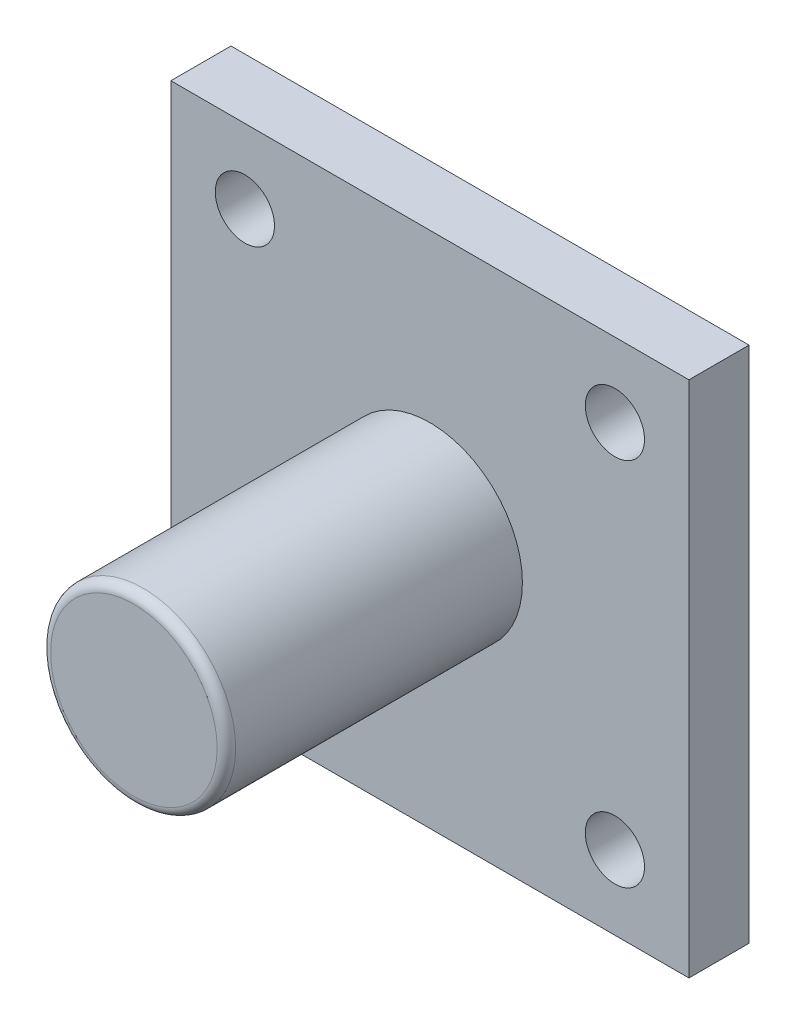
ISO-10303-21;
HEADER;
FILE_DESCRIPTION(('STEP AP214'),'2;1');
FILE_NAME('part.step','',(''),(''),'','','');
FILE_SCHEMA(('AUTOMOTIVE_DESIGN { 1 0 10303 214 1 1 1 1 }'));
ENDSEC;
DATA;
#1=APPLICATION_CONTEXT('core data for automotive mechanical design processes');
#2=APPLICATION_PROTOCOL_DEFINITION('international standard','automotive_design',2000,#1);
#3=PRODUCT_CONTEXT('',#1,'mechanical');
#4=PRODUCT('Part','Part','',(#3));
#5=PRODUCT_RELATED_PRODUCT_CATEGORY('part','',(#4));
#6=PRODUCT_DEFINITION_FORMATION('','',#4);
#7=PRODUCT_DEFINITION_CONTEXT('part definition',#1,'design');
#8=PRODUCT_DEFINITION('design','',#6,#7);
#9=PRODUCT_DEFINITION_SHAPE('','',#8);
#10=(LENGTH_UNIT() NAMED_UNIT(*) SI_UNIT(.MILLI.,.METRE.));
#11=(NAMED_UNIT(*) PLANE_ANGLE_UNIT() SI_UNIT($,.RADIAN.));
#12=(NAMED_UNIT(*) SI_UNIT($,.STERADIAN.) SOLID_ANGLE_UNIT());
#13=UNCERTAINTY_MEASURE_WITH_UNIT(LENGTH_MEASURE(1.E-05),#10,'distance_accuracy_value','');
#14=(GEOMETRIC_REPRESENTATION_CONTEXT(3) GLOBAL_UNCERTAINTY_ASSIGNED_CONTEXT((#13)) GLOBAL_UNIT_ASSIGNED_CONTEXT((#10,
#11,#12)) REPRESENTATION_CONTEXT('',''));
#15=CARTESIAN_POINT('',(0.,0.,0.));
#16=DIRECTION('',(0.,0.,1.));
#17=DIRECTION('',(1.,0.,0.));
#18=AXIS2_PLACEMENT_3D('',#15,#16,#17);
#19=CARTESIAN_POINT('',(0.,0.,0.));
#20=DIRECTION('',(0.,0.,-1.));
#21=DIRECTION('',(-1.,0.,0.));
#22=AXIS2_PLACEMENT_3D('',#19,#20,#21);
#23=PLANE('',#22);
#24=CARTESIAN_POINT('',(24.,4.,0.));
#25=DIRECTION('',(0.,0.,-1.));
#26=DIRECTION('',(-1.,0.,0.));
#27=AXIS2_PLACEMENT_3D('',#24,#25,#26);
#28=CIRCLE('',#27,1.6);
#29=CARTESIAN_POINT('',(22.4,4.,0.));
#30=VERTEX_POINT('',#29);
#31=EDGE_CURVE('E332',#30,#30,#28,.T.);
#32=ORIENTED_EDGE('',*,*,#31,.F.);
#33=EDGE_LOOP('',(#32));
#34=FACE_BOUND('',#33,.T.);
#35=CARTESIAN_POINT('',(4.,4.,0.));
#36=DIRECTION('',(0.,0.,-1.));
#37=DIRECTION('',(-1.,0.,0.));
#38=AXIS2_PLACEMENT_3D('',#35,#36,#37);
#39=CIRCLE('',#38,1.6);
#40=CARTESIAN_POINT('',(2.4,4.,0.));
#41=VERTEX_POINT('',#40);
#42=EDGE_CURVE('E338',#41,#41,#39,.T.);
#43=ORIENTED_EDGE('',*,*,#42,.F.);
#44=EDGE_LOOP('',(#43));
#45=FACE_BOUND('',#44,.T.);
#46=CARTESIAN_POINT('',(4.,24.,0.));
#47=DIRECTION('',(0.,0.,-1.));
#48=DIRECTION('',(-1.,0.,0.));
#49=AXIS2_PLACEMENT_3D('',#46,#47,#48);
#50=CIRCLE('',#49,1.6);
#51=CARTESIAN_POINT('',(2.4,24.,0.));
#52=VERTEX_POINT('',#51);
#53=EDGE_CURVE('E333',#52,#52,#50,.T.);
#54=ORIENTED_EDGE('',*,*,#53,.F.);
#55=EDGE_LOOP('',(#54));
#56=FACE_BOUND('',#55,.T.);
#57=CARTESIAN_POINT('',(24.,24.,0.));
#58=DIRECTION('',(0.,0.,-1.));
#59=DIRECTION('',(-1.,0.,0.));
#60=AXIS2_PLACEMENT_3D('',#57,#58,#59);
#61=CIRCLE('',#60,1.6);
#62=CARTESIAN_POINT('',(22.4,24.,0.));
#63=VERTEX_POINT('',#62);
#64=EDGE_CURVE('E337',#63,#63,#61,.T.);
#65=ORIENTED_EDGE('',*,*,#64,.F.);
#66=EDGE_LOOP('',(#65));
#67=FACE_BOUND('',#66,.T.);
#68=DIRECTION('',(0.,-1.,0.));
#69=VECTOR('',#68,1.);
#70=CARTESIAN_POINT('',(0.,0.,0.));
#71=LINE('',#70,#69);
#72=CARTESIAN_POINT('',(0.,28.,0.));
#73=VERTEX_POINT('',#72);
#74=CARTESIAN_POINT('',(0.,0.,0.));
#75=VERTEX_POINT('',#74);
#76=EDGE_CURVE('E364',#73,#75,#71,.T.);
#77=ORIENTED_EDGE('',*,*,#76,.F.);
#78=DIRECTION('',(-1.,0.,0.));
#79=VECTOR('',#78,1.);
#80=CARTESIAN_POINT('',(0.,28.,0.));
#81=LINE('',#80,#79);
#82=CARTESIAN_POINT('',(28.,28.,0.));
#83=VERTEX_POINT('',#82);
#84=EDGE_CURVE('E375',#83,#73,#81,.T.);
#85=ORIENTED_EDGE('',*,*,#84,.F.);
#86=DIRECTION('',(0.,1.,0.));
#87=VECTOR('',#86,1.);
#88=CARTESIAN_POINT('',(28.,0.,0.));
#89=LINE('',#88,#87);
#90=CARTESIAN_POINT('',(28.,0.,0.));
#91=VERTEX_POINT('',#90);
#92=EDGE_CURVE('E391',#91,#83,#89,.T.);
#93=ORIENTED_EDGE('',*,*,#92,.F.);
#94=DIRECTION('',(1.,0.,0.));
#95=VECTOR('',#94,1.);
#96=CARTESIAN_POINT('',(0.,0.,0.));
#97=LINE('',#96,#95);
#98=EDGE_CURVE('E388',#75,#91,#97,.T.);
#99=ORIENTED_EDGE('',*,*,#98,.F.);
#100=EDGE_LOOP('',(#77,#85,#93,#99));
#101=FACE_BOUND('',#100,.T.);
#102=DIRECTION('',(-1.,0.,0.));
#103=VECTOR('',#102,1.);
#104=CARTESIAN_POINT('',(20.5,23.,0.));
#105=LINE('',#104,#103);
#106=CARTESIAN_POINT('',(20.5,23.,0.));
#107=VERTEX_POINT('',#106);
#108=CARTESIAN_POINT('',(7.50000000000001,23.,0.));
#109=VERTEX_POINT('',#108);
#110=EDGE_CURVE('E310',#107,#109,#105,.T.);
#111=ORIENTED_EDGE('',*,*,#110,.F.);
#112=DIRECTION('',(0.,-1.,0.));
#113=VECTOR('',#112,1.);
#114=CARTESIAN_POINT('',(20.5,25.5,0.));
#115=LINE('',#114,#113);
#116=CARTESIAN_POINT('',(20.5,25.5,0.));
#117=VERTEX_POINT('',#116);
#118=EDGE_CURVE('E291',#117,#107,#115,.T.);
#119=ORIENTED_EDGE('',*,*,#118,.F.);
#120=DIRECTION('',(1.,0.,0.));
#121=VECTOR('',#120,1.);
#122=CARTESIAN_POINT('',(20.5,25.5,0.));
#123=LINE('',#122,#121);
#124=CARTESIAN_POINT('',(7.50000000000001,25.5,0.));
#125=VERTEX_POINT('',#124);
#126=EDGE_CURVE('E297',#125,#117,#123,.T.);
#127=ORIENTED_EDGE('',*,*,#126,.F.);
#128=DIRECTION('',(0.,1.,0.));
#129=VECTOR('',#128,1.);
#130=CARTESIAN_POINT('',(7.50000000000001,25.5,0.));
#131=LINE('',#130,#129);
#132=EDGE_CURVE('E313',#109,#125,#131,.T.);
#133=ORIENTED_EDGE('',*,*,#132,.F.);
#134=EDGE_LOOP('',(#111,#119,#127,#133));
#135=FACE_BOUND('',#134,.T.);
#136=DIRECTION('',(-1.,0.,0.));
#137=VECTOR('',#136,1.);
#138=CARTESIAN_POINT('',(5.,7.5,0.));
#139=LINE('',#138,#137);
#140=CARTESIAN_POINT('',(5.,7.5,0.));
#141=VERTEX_POINT('',#140);
#142=CARTESIAN_POINT('',(2.5,7.5,0.));
#143=VERTEX_POINT('',#142);
#144=EDGE_CURVE('E269',#141,#143,#139,.T.);
#145=ORIENTED_EDGE('',*,*,#144,.F.);
#146=DIRECTION('',(0.,-1.,0.));
#147=VECTOR('',#146,1.);
#148=CARTESIAN_POINT('',(5.,20.5,0.));
#149=LINE('',#148,#147);
#150=CARTESIAN_POINT('',(5.,20.5,0.));
#151=VERTEX_POINT('',#150);
#152=EDGE_CURVE('E250',#151,#141,#149,.T.);
#153=ORIENTED_EDGE('',*,*,#152,.F.);
#154=DIRECTION('',(1.,0.,0.));
#155=VECTOR('',#154,1.);
#156=CARTESIAN_POINT('',(5.,20.5,0.));
#157=LINE('',#156,#155);
#158=CARTESIAN_POINT('',(2.5,20.5,0.));
#159=VERTEX_POINT('',#158);
#160=EDGE_CURVE('E256',#159,#151,#157,.T.);
#161=ORIENTED_EDGE('',*,*,#160,.F.);
#162=DIRECTION('',(0.,1.,0.));
#163=VECTOR('',#162,1.);
#164=CARTESIAN_POINT('',(2.5,20.5,0.));
#165=LINE('',#164,#163);
#166=EDGE_CURVE('E272',#143,#159,#165,.T.);
#167=ORIENTED_EDGE('',*,*,#166,.F.);
#168=EDGE_LOOP('',(#145,#153,#161,#167));
#169=FACE_BOUND('',#168,.T.);
#170=DIRECTION('',(1.,0.,0.));
#171=VECTOR('',#170,1.);
#172=CARTESIAN_POINT('',(7.5,5.,0.));
#173=LINE('',#172,#171);
#174=CARTESIAN_POINT('',(7.5,5.,0.));
#175=VERTEX_POINT('',#174);
#176=CARTESIAN_POINT('',(20.5,5.,0.));
#177=VERTEX_POINT('',#176);
#178=EDGE_CURVE('E211',#175,#177,#173,.T.);
#179=ORIENTED_EDGE('',*,*,#178,.F.);
#180=DIRECTION('',(0.,1.,0.));
#181=VECTOR('',#180,1.);
#182=CARTESIAN_POINT('',(7.5,5.,0.));
#183=LINE('',#182,#181);
#184=CARTESIAN_POINT('',(7.5,2.5,0.));
#185=VERTEX_POINT('',#184);
#186=EDGE_CURVE('E206',#185,#175,#183,.T.);
#187=ORIENTED_EDGE('',*,*,#186,.F.);
#188=DIRECTION('',(-1.,0.,0.));
#189=VECTOR('',#188,1.);
#190=CARTESIAN_POINT('',(7.5,2.5,0.));
#191=LINE('',#190,#189);
#192=CARTESIAN_POINT('',(20.5,2.5,0.));
#193=VERTEX_POINT('',#192);
#194=EDGE_CURVE('E221',#193,#185,#191,.T.);
#195=ORIENTED_EDGE('',*,*,#194,.F.);
#196=DIRECTION('',(0.,-1.,0.));
#197=VECTOR('',#196,1.);
#198=CARTESIAN_POINT('',(20.5,5.,0.));
#199=LINE('',#198,#197);
#200=EDGE_CURVE('E233',#177,#193,#199,.T.);
#201=ORIENTED_EDGE('',*,*,#200,.F.);
#202=EDGE_LOOP('',(#179,#187,#195,#201));
#203=FACE_BOUND('',#202,.T.);
#204=DIRECTION('',(1.,0.,0.));
#205=VECTOR('',#204,1.);
#206=CARTESIAN_POINT('',(23.,20.5,0.));
#207=LINE('',#206,#205);
#208=CARTESIAN_POINT('',(23.,20.5,0.));
#209=VERTEX_POINT('',#208);
#210=CARTESIAN_POINT('',(25.5,20.5,0.));
#211=VERTEX_POINT('',#210);
#212=EDGE_CURVE('E767',#209,#211,#207,.T.);
#213=ORIENTED_EDGE('',*,*,#212,.F.);
#214=DIRECTION('',(0.,1.,0.));
#215=VECTOR('',#214,1.);
#216=CARTESIAN_POINT('',(23.,7.5,0.));
#217=LINE('',#216,#215);
#218=CARTESIAN_POINT('',(23.,7.5,0.));
#219=VERTEX_POINT('',#218);
#220=EDGE_CURVE('E203',#219,#209,#217,.T.);
#221=ORIENTED_EDGE('',*,*,#220,.F.);
#222=DIRECTION('',(-1.,0.,0.));
#223=VECTOR('',#222,1.);
#224=CARTESIAN_POINT('',(23.,7.5,0.));
#225=LINE('',#224,#223);
#226=CARTESIAN_POINT('',(25.5,7.5,0.));
#227=VERTEX_POINT('',#226);
#228=EDGE_CURVE('E199',#227,#219,#225,.T.);
#229=ORIENTED_EDGE('',*,*,#228,.F.);
#230=DIRECTION('',(0.,-1.,0.));
#231=VECTOR('',#230,1.);
#232=CARTESIAN_POINT('',(25.5,7.5,0.));
#233=LINE('',#232,#231);
#234=EDGE_CURVE('E763',#211,#227,#233,.T.);
#235=ORIENTED_EDGE('',*,*,#234,.F.);
#236=EDGE_LOOP('',(#213,#221,#229,#235));
#237=FACE_BOUND('',#236,.T.);
#238=ADVANCED_FACE('F39',(#34,#45,#56,#67,#101,#135,#169,#203,#237),#23,.T.);
#239=CARTESIAN_POINT('',(0.,0.,3.25));
#240=DIRECTION('',(1.,0.,0.));
#241=DIRECTION('',(0.,1.,0.));
#242=AXIS2_PLACEMENT_3D('',#239,#240,#241);
#243=PLANE('',#242);
#244=ORIENTED_EDGE('',*,*,#76,.T.);
#245=DIRECTION('',(0.,0.,-1.));
#246=VECTOR('',#245,1.);
#247=CARTESIAN_POINT('',(0.,0.,3.25));
#248=LINE('',#247,#246);
#249=CARTESIAN_POINT('',(0.,0.,3.25));
#250=VERTEX_POINT('',#249);
#251=EDGE_CURVE('E369',#250,#75,#248,.T.);
#252=ORIENTED_EDGE('',*,*,#251,.F.);
#253=DIRECTION('',(0.,-1.,0.));
#254=VECTOR('',#253,1.);
#255=CARTESIAN_POINT('',(0.,0.,3.25));
#256=LINE('',#255,#254);
#257=CARTESIAN_POINT('',(0.,28.,3.25));
#258=VERTEX_POINT('',#257);
#259=EDGE_CURVE('E370',#258,#250,#256,.T.);
#260=ORIENTED_EDGE('',*,*,#259,.F.);
#261=DIRECTION('',(0.,0.,-1.));
#262=VECTOR('',#261,1.);
#263=CARTESIAN_POINT('',(0.,28.,3.25));
#264=LINE('',#263,#262);
#265=EDGE_CURVE('E384',#258,#73,#264,.T.);
#266=ORIENTED_EDGE('',*,*,#265,.T.);
#267=EDGE_LOOP('',(#244,#252,#260,#266));
#268=FACE_BOUND('',#267,.T.);
#269=ADVANCED_FACE('F431',(#268),#243,.F.);
#270=CARTESIAN_POINT('',(0.,0.,3.25));
#271=DIRECTION('',(0.,1.,0.));
#272=DIRECTION('',(0.,0.,1.));
#273=AXIS2_PLACEMENT_3D('',#270,#271,#272);
#274=PLANE('',#273);
#275=ORIENTED_EDGE('',*,*,#98,.T.);
#276=DIRECTION('',(0.,0.,-1.));
#277=VECTOR('',#276,1.);
#278=CARTESIAN_POINT('',(28.,0.,3.25));
#279=LINE('',#278,#277);
#280=CARTESIAN_POINT('',(28.,0.,3.25));
#281=VERTEX_POINT('',#280);
#282=EDGE_CURVE('E403',#281,#91,#279,.T.);
#283=ORIENTED_EDGE('',*,*,#282,.F.);
#284=DIRECTION('',(1.,0.,0.));
#285=VECTOR('',#284,1.);
#286=CARTESIAN_POINT('',(0.,0.,3.25));
#287=LINE('',#286,#285);
#288=EDGE_CURVE('E374',#250,#281,#287,.T.);
#289=ORIENTED_EDGE('',*,*,#288,.F.);
#290=ORIENTED_EDGE('',*,*,#251,.T.);
#291=EDGE_LOOP('',(#275,#283,#289,#290));
#292=FACE_BOUND('',#291,.T.);
#293=ADVANCED_FACE('F437',(#292),#274,.F.);
#294=CARTESIAN_POINT('',(28.,0.,3.25));
#295=DIRECTION('',(-1.,0.,0.));
#296=DIRECTION('',(0.,-1.,0.));
#297=AXIS2_PLACEMENT_3D('',#294,#295,#296);
#298=PLANE('',#297);
#299=ORIENTED_EDGE('',*,*,#92,.T.);
#300=DIRECTION('',(0.,0.,-1.));
#301=VECTOR('',#300,1.);
#302=CARTESIAN_POINT('',(28.,28.,3.25));
#303=LINE('',#302,#301);
#304=CARTESIAN_POINT('',(28.,28.,3.25));
#305=VERTEX_POINT('',#304);
#306=EDGE_CURVE('E399',#305,#83,#303,.T.);
#307=ORIENTED_EDGE('',*,*,#306,.F.);
#308=DIRECTION('',(0.,1.,0.));
#309=VECTOR('',#308,1.);
#310=CARTESIAN_POINT('',(28.,0.,3.25));
#311=LINE('',#310,#309);
#312=EDGE_CURVE('E378',#281,#305,#311,.T.);
#313=ORIENTED_EDGE('',*,*,#312,.F.);
#314=ORIENTED_EDGE('',*,*,#282,.T.);
#315=EDGE_LOOP('',(#299,#307,#313,#314));
#316=FACE_BOUND('',#315,.T.);
#317=ADVANCED_FACE('F448',(#316),#298,.F.);
#318=CARTESIAN_POINT('',(0.,28.,3.25));
#319=DIRECTION('',(0.,-1.,0.));
#320=DIRECTION('',(0.,0.,-1.));
#321=AXIS2_PLACEMENT_3D('',#318,#319,#320);
#322=PLANE('',#321);
#323=ORIENTED_EDGE('',*,*,#84,.T.);
#324=ORIENTED_EDGE('',*,*,#265,.F.);
#325=DIRECTION('',(-1.,0.,0.));
#326=VECTOR('',#325,1.);
#327=CARTESIAN_POINT('',(0.,28.,3.25));
#328=LINE('',#327,#326);
#329=EDGE_CURVE('E381',#305,#258,#328,.T.);
#330=ORIENTED_EDGE('',*,*,#329,.F.);
#331=ORIENTED_EDGE('',*,*,#306,.T.);
#332=EDGE_LOOP('',(#323,#324,#330,#331));
#333=FACE_BOUND('',#332,.T.);
#334=ADVANCED_FACE('F445',(#333),#322,.F.);
#335=CARTESIAN_POINT('',(0.,0.,3.25));
#336=DIRECTION('',(0.,0.,-1.));
#337=DIRECTION('',(-1.,0.,0.));
#338=AXIS2_PLACEMENT_3D('',#335,#336,#337);
#339=PLANE('',#338);
#340=CARTESIAN_POINT('',(24.,4.,3.25));
#341=DIRECTION('',(0.,0.,-1.));
#342=DIRECTION('',(-1.,0.,0.));
#343=AXIS2_PLACEMENT_3D('',#340,#341,#342);
#344=CIRCLE('',#343,1.6);
#345=CARTESIAN_POINT('',(22.4,4.,3.25));
#346=VERTEX_POINT('',#345);
#347=EDGE_CURVE('E360',#346,#346,#344,.T.);
#348=ORIENTED_EDGE('',*,*,#347,.T.);
#349=EDGE_LOOP('',(#348));
#350=FACE_BOUND('',#349,.T.);
#351=CARTESIAN_POINT('',(4.,4.,3.25));
#352=DIRECTION('',(0.,0.,-1.));
#353=DIRECTION('',(-1.,0.,0.));
#354=AXIS2_PLACEMENT_3D('',#351,#352,#353);
#355=CIRCLE('',#354,1.6);
#356=CARTESIAN_POINT('',(2.4,4.,3.25));
#357=VERTEX_POINT('',#356);
#358=EDGE_CURVE('E356',#357,#357,#355,.T.);
#359=ORIENTED_EDGE('',*,*,#358,.T.);
#360=EDGE_LOOP('',(#359));
#361=FACE_BOUND('',#360,.T.);
#362=CARTESIAN_POINT('',(4.,24.,3.25));
#363=DIRECTION('',(0.,0.,-1.));
#364=DIRECTION('',(-1.,0.,0.));
#365=AXIS2_PLACEMENT_3D('',#362,#363,#364);
#366=CIRCLE('',#365,1.6);
#367=CARTESIAN_POINT('',(2.4,24.,3.25));
#368=VERTEX_POINT('',#367);
#369=EDGE_CURVE('E352',#368,#368,#366,.T.);
#370=ORIENTED_EDGE('',*,*,#369,.T.);
#371=EDGE_LOOP('',(#370));
#372=FACE_BOUND('',#371,.T.);
#373=CARTESIAN_POINT('',(24.,24.,3.25));
#374=DIRECTION('',(0.,0.,-1.));
#375=DIRECTION('',(-1.,0.,0.));
#376=AXIS2_PLACEMENT_3D('',#373,#374,#375);
#377=CIRCLE('',#376,1.6);
#378=CARTESIAN_POINT('',(22.4,24.,3.25));
#379=VERTEX_POINT('',#378);
#380=EDGE_CURVE('E348',#379,#379,#377,.T.);
#381=ORIENTED_EDGE('',*,*,#380,.T.);
#382=EDGE_LOOP('',(#381));
#383=FACE_BOUND('',#382,.T.);
#384=CARTESIAN_POINT('',(14.,14.,3.25));
#385=DIRECTION('',(0.,0.,1.));
#386=DIRECTION('',(1.,0.,0.));
#387=AXIS2_PLACEMENT_3D('',#384,#385,#386);
#388=CIRCLE('',#387,5.);
#389=CARTESIAN_POINT('',(19.,14.,3.25));
#390=VERTEX_POINT('',#389);
#391=EDGE_CURVE('E365',#390,#390,#388,.T.);
#392=ORIENTED_EDGE('',*,*,#391,.F.);
#393=EDGE_LOOP('',(#392));
#394=FACE_BOUND('',#393,.T.);
#395=ORIENTED_EDGE('',*,*,#259,.T.);
#396=ORIENTED_EDGE('',*,*,#288,.T.);
#397=ORIENTED_EDGE('',*,*,#312,.T.);
#398=ORIENTED_EDGE('',*,*,#329,.T.);
#399=EDGE_LOOP('',(#395,#396,#397,#398));
#400=FACE_BOUND('',#399,.T.);
#401=ADVANCED_FACE('F443',(#350,#361,#372,#383,#394,#400),#339,.F.);
#402=CARTESIAN_POINT('',(14.,14.,19.25));
#403=DIRECTION('',(0.,0.,-1.));
#404=DIRECTION('',(-1.,0.,0.));
#405=AXIS2_PLACEMENT_3D('',#402,#403,#404);
#406=CYLINDRICAL_SURFACE('',#405,5.);
#407=CARTESIAN_POINT('',(14.,14.,18.75));
#408=DIRECTION('',(0.,0.,1.));
#409=DIRECTION('',(1.,0.,0.));
#410=AXIS2_PLACEMENT_3D('',#407,#408,#409);
#411=CIRCLE('',#410,5.);
#412=CARTESIAN_POINT('',(19.,14.,18.75));
#413=VERTEX_POINT('',#412);
#414=EDGE_CURVE('E11',#413,#413,#411,.F.);
#415=ORIENTED_EDGE('',*,*,#414,.T.);
#416=EDGE_LOOP('',(#415));
#417=FACE_BOUND('',#416,.T.);
#418=ORIENTED_EDGE('',*,*,#391,.T.);
#419=EDGE_LOOP('',(#418));
#420=FACE_BOUND('',#419,.T.);
#421=ADVANCED_FACE('F471',(#417,#420),#406,.T.);
#422=CARTESIAN_POINT('',(14.,14.,19.25));
#423=DIRECTION('',(0.,0.,1.));
#424=DIRECTION('',(1.,0.,0.));
#425=AXIS2_PLACEMENT_3D('',#422,#423,#424);
#426=PLANE('',#425);
#427=CARTESIAN_POINT('',(14.,14.,19.25));
#428=DIRECTION('',(0.,0.,1.));
#429=DIRECTION('',(1.,0.,0.));
#430=AXIS2_PLACEMENT_3D('',#427,#428,#429);
#431=CIRCLE('',#430,4.5);
#432=CARTESIAN_POINT('',(18.5,14.,19.25));
#433=VERTEX_POINT('',#432);
#434=EDGE_CURVE('E48',#433,#433,#431,.T.);
#435=ORIENTED_EDGE('',*,*,#434,.T.);
#436=EDGE_LOOP('',(#435));
#437=FACE_BOUND('',#436,.T.);
#438=ADVANCED_FACE('F413',(#437),#426,.T.);
#439=CARTESIAN_POINT('',(24.,24.,19.25));
#440=DIRECTION('',(0.,0.,-1.));
#441=DIRECTION('',(-1.,0.,0.));
#442=AXIS2_PLACEMENT_3D('',#439,#440,#441);
#443=CYLINDRICAL_SURFACE('',#442,1.6);
#444=ORIENTED_EDGE('',*,*,#64,.T.);
#445=EDGE_LOOP('',(#444));
#446=FACE_BOUND('',#445,.T.);
#447=ORIENTED_EDGE('',*,*,#380,.F.);
#448=EDGE_LOOP('',(#447));
#449=FACE_BOUND('',#448,.T.);
#450=ADVANCED_FACE('F488',(#446,#449),#443,.F.);
#451=CARTESIAN_POINT('',(4.,24.,19.25));
#452=DIRECTION('',(0.,0.,-1.));
#453=DIRECTION('',(-1.,0.,0.));
#454=AXIS2_PLACEMENT_3D('',#451,#452,#453);
#455=CYLINDRICAL_SURFACE('',#454,1.6);
#456=ORIENTED_EDGE('',*,*,#53,.T.);
#457=EDGE_LOOP('',(#456));
#458=FACE_BOUND('',#457,.T.);
#459=ORIENTED_EDGE('',*,*,#369,.F.);
#460=EDGE_LOOP('',(#459));
#461=FACE_BOUND('',#460,.T.);
#462=ADVANCED_FACE('F490',(#458,#461),#455,.F.);
#463=CARTESIAN_POINT('',(4.,4.,19.25));
#464=DIRECTION('',(0.,0.,-1.));
#465=DIRECTION('',(-1.,0.,0.));
#466=AXIS2_PLACEMENT_3D('',#463,#464,#465);
#467=CYLINDRICAL_SURFACE('',#466,1.6);
#468=ORIENTED_EDGE('',*,*,#42,.T.);
#469=EDGE_LOOP('',(#468));
#470=FACE_BOUND('',#469,.T.);
#471=ORIENTED_EDGE('',*,*,#358,.F.);
#472=EDGE_LOOP('',(#471));
#473=FACE_BOUND('',#472,.T.);
#474=ADVANCED_FACE('F426',(#470,#473),#467,.F.);
#475=CARTESIAN_POINT('',(24.,4.,19.25));
#476=DIRECTION('',(0.,0.,-1.));
#477=DIRECTION('',(-1.,0.,0.));
#478=AXIS2_PLACEMENT_3D('',#475,#476,#477);
#479=CYLINDRICAL_SURFACE('',#478,1.6);
#480=ORIENTED_EDGE('',*,*,#31,.T.);
#481=EDGE_LOOP('',(#480));
#482=FACE_BOUND('',#481,.T.);
#483=ORIENTED_EDGE('',*,*,#347,.F.);
#484=EDGE_LOOP('',(#483));
#485=FACE_BOUND('',#484,.T.);
#486=ADVANCED_FACE('F417',(#482,#485),#479,.F.);
#487=CARTESIAN_POINT('',(14.,14.,18.75));
#488=DIRECTION('',(0.,0.,1.));
#489=DIRECTION('',(1.,0.,0.));
#490=AXIS2_PLACEMENT_3D('',#487,#488,#489);
#491=TOROIDAL_SURFACE('',#490,4.5,0.5);
#492=ORIENTED_EDGE('',*,*,#414,.F.);
#493=EDGE_LOOP('',(#492));
#494=FACE_BOUND('',#493,.T.);
#495=ORIENTED_EDGE('',*,*,#434,.F.);
#496=EDGE_LOOP('',(#495));
#497=FACE_BOUND('',#496,.T.);
#498=ADVANCED_FACE('F41',(#494,#497),#491,.T.);
#499=CARTESIAN_POINT('',(20.5,25.5,-0.5));
#500=DIRECTION('',(-1.,0.,0.));
#501=DIRECTION('',(0.,0.,1.));
#502=AXIS2_PLACEMENT_3D('',#499,#500,#501);
#503=PLANE('',#502);
#504=ORIENTED_EDGE('',*,*,#118,.T.);
#505=DIRECTION('',(0.,0.,1.));
#506=VECTOR('',#505,1.);
#507=CARTESIAN_POINT('',(20.5,23.,-0.5));
#508=LINE('',#507,#506);
#509=CARTESIAN_POINT('',(20.5,23.,-0.5));
#510=VERTEX_POINT('',#509);
#511=EDGE_CURVE('E329',#510,#107,#508,.T.);
#512=ORIENTED_EDGE('',*,*,#511,.F.);
#513=DIRECTION('',(0.,-1.,0.));
#514=VECTOR('',#513,1.);
#515=CARTESIAN_POINT('',(20.5,25.5,-0.5));
#516=LINE('',#515,#514);
#517=CARTESIAN_POINT('',(20.5,25.5,-0.5));
#518=VERTEX_POINT('',#517);
#519=EDGE_CURVE('E292',#518,#510,#516,.T.);
#520=ORIENTED_EDGE('',*,*,#519,.F.);
#521=DIRECTION('',(0.,0.,1.));
#522=VECTOR('',#521,1.);
#523=CARTESIAN_POINT('',(20.5,25.5,-0.5));
#524=LINE('',#523,#522);
#525=EDGE_CURVE('E306',#518,#117,#524,.T.);
#526=ORIENTED_EDGE('',*,*,#525,.T.);
#527=EDGE_LOOP('',(#504,#512,#520,#526));
#528=FACE_BOUND('',#527,.T.);
#529=ADVANCED_FACE('F416',(#528),#503,.F.);
#530=CARTESIAN_POINT('',(20.5,23.,-0.5));
#531=DIRECTION('',(0.,1.,0.));
#532=DIRECTION('',(0.,0.,1.));
#533=AXIS2_PLACEMENT_3D('',#530,#531,#532);
#534=PLANE('',#533);
#535=ORIENTED_EDGE('',*,*,#110,.T.);
#536=DIRECTION('',(0.,0.,1.));
#537=VECTOR('',#536,1.);
#538=CARTESIAN_POINT('',(7.50000000000001,23.,-0.5));
#539=LINE('',#538,#537);
#540=CARTESIAN_POINT('',(7.50000000000001,23.,-0.5));
#541=VERTEX_POINT('',#540);
#542=EDGE_CURVE('E325',#541,#109,#539,.T.);
#543=ORIENTED_EDGE('',*,*,#542,.F.);
#544=DIRECTION('',(-1.,0.,0.));
#545=VECTOR('',#544,1.);
#546=CARTESIAN_POINT('',(20.5,23.,-0.5));
#547=LINE('',#546,#545);
#548=EDGE_CURVE('E296',#510,#541,#547,.T.);
#549=ORIENTED_EDGE('',*,*,#548,.F.);
#550=ORIENTED_EDGE('',*,*,#511,.T.);
#551=EDGE_LOOP('',(#535,#543,#549,#550));
#552=FACE_BOUND('',#551,.T.);
#553=ADVANCED_FACE('F423',(#552),#534,.F.);
#554=CARTESIAN_POINT('',(7.50000000000001,25.5,-0.5));
#555=DIRECTION('',(1.,0.,0.));
#556=DIRECTION('',(0.,0.,-1.));
#557=AXIS2_PLACEMENT_3D('',#554,#555,#556);
#558=PLANE('',#557);
#559=ORIENTED_EDGE('',*,*,#132,.T.);
#560=DIRECTION('',(0.,0.,1.));
#561=VECTOR('',#560,1.);
#562=CARTESIAN_POINT('',(7.50000000000001,25.5,-0.5));
#563=LINE('',#562,#561);
#564=CARTESIAN_POINT('',(7.50000000000001,25.5,-0.5));
#565=VERTEX_POINT('',#564);
#566=EDGE_CURVE('E322',#565,#125,#563,.T.);
#567=ORIENTED_EDGE('',*,*,#566,.F.);
#568=DIRECTION('',(0.,1.,0.));
#569=VECTOR('',#568,1.);
#570=CARTESIAN_POINT('',(7.50000000000001,25.5,-0.5));
#571=LINE('',#570,#569);
#572=EDGE_CURVE('E300',#541,#565,#571,.T.);
#573=ORIENTED_EDGE('',*,*,#572,.F.);
#574=ORIENTED_EDGE('',*,*,#542,.T.);
#575=EDGE_LOOP('',(#559,#567,#573,#574));
#576=FACE_BOUND('',#575,.T.);
#577=ADVANCED_FACE('F506',(#576),#558,.F.);
#578=CARTESIAN_POINT('',(20.5,25.5,-0.5));
#579=DIRECTION('',(0.,-1.,0.));
#580=DIRECTION('',(1.,0.,0.));
#581=AXIS2_PLACEMENT_3D('',#578,#579,#580);
#582=PLANE('',#581);
#583=ORIENTED_EDGE('',*,*,#126,.T.);
#584=ORIENTED_EDGE('',*,*,#525,.F.);
#585=DIRECTION('',(1.,0.,0.));
#586=VECTOR('',#585,1.);
#587=CARTESIAN_POINT('',(20.5,25.5,-0.5));
#588=LINE('',#587,#586);
#589=EDGE_CURVE('E303',#565,#518,#588,.T.);
#590=ORIENTED_EDGE('',*,*,#589,.F.);
#591=ORIENTED_EDGE('',*,*,#566,.T.);
#592=EDGE_LOOP('',(#583,#584,#590,#591));
#593=FACE_BOUND('',#592,.T.);
#594=ADVANCED_FACE('F510',(#593),#582,.F.);
#595=CARTESIAN_POINT('',(0.,0.,-0.5));
#596=DIRECTION('',(0.,0.,-1.));
#597=DIRECTION('',(-1.,0.,0.));
#598=AXIS2_PLACEMENT_3D('',#595,#596,#597);
#599=PLANE('',#598);
#600=ORIENTED_EDGE('',*,*,#519,.T.);
#601=ORIENTED_EDGE('',*,*,#548,.T.);
#602=ORIENTED_EDGE('',*,*,#572,.T.);
#603=ORIENTED_EDGE('',*,*,#589,.T.);
#604=EDGE_LOOP('',(#600,#601,#602,#603));
#605=FACE_BOUND('',#604,.T.);
#606=ADVANCED_FACE('F514',(#605),#599,.T.);
#607=CARTESIAN_POINT('',(5.,20.5,-0.5));
#608=DIRECTION('',(-1.,0.,0.));
#609=DIRECTION('',(0.,-1.,0.));
#610=AXIS2_PLACEMENT_3D('',#607,#608,#609);
#611=PLANE('',#610);
#612=ORIENTED_EDGE('',*,*,#152,.T.);
#613=DIRECTION('',(0.,0.,1.));
#614=VECTOR('',#613,1.);
#615=CARTESIAN_POINT('',(5.,7.5,-0.5));
#616=LINE('',#615,#614);
#617=CARTESIAN_POINT('',(5.,7.5,-0.5));
#618=VERTEX_POINT('',#617);
#619=EDGE_CURVE('E288',#618,#141,#616,.T.);
#620=ORIENTED_EDGE('',*,*,#619,.F.);
#621=DIRECTION('',(0.,-1.,0.));
#622=VECTOR('',#621,1.);
#623=CARTESIAN_POINT('',(5.,20.5,-0.5));
#624=LINE('',#623,#622);
#625=CARTESIAN_POINT('',(5.,20.5,-0.5));
#626=VERTEX_POINT('',#625);
#627=EDGE_CURVE('E251',#626,#618,#624,.T.);
#628=ORIENTED_EDGE('',*,*,#627,.F.);
#629=DIRECTION('',(0.,0.,1.));
#630=VECTOR('',#629,1.);
#631=CARTESIAN_POINT('',(5.,20.5,-0.5));
#632=LINE('',#631,#630);
#633=EDGE_CURVE('E265',#626,#151,#632,.T.);
#634=ORIENTED_EDGE('',*,*,#633,.T.);
#635=EDGE_LOOP('',(#612,#620,#628,#634));
#636=FACE_BOUND('',#635,.T.);
#637=ADVANCED_FACE('F518',(#636),#611,.F.);
#638=CARTESIAN_POINT('',(5.,7.5,-0.5));
#639=DIRECTION('',(0.,1.,0.));
#640=DIRECTION('',(0.,0.,1.));
#641=AXIS2_PLACEMENT_3D('',#638,#639,#640);
#642=PLANE('',#641);
#643=ORIENTED_EDGE('',*,*,#144,.T.);
#644=DIRECTION('',(0.,0.,1.));
#645=VECTOR('',#644,1.);
#646=CARTESIAN_POINT('',(2.5,7.5,-0.5));
#647=LINE('',#646,#645);
#648=CARTESIAN_POINT('',(2.5,7.5,-0.5));
#649=VERTEX_POINT('',#648);
#650=EDGE_CURVE('E284',#649,#143,#647,.T.);
#651=ORIENTED_EDGE('',*,*,#650,.F.);
#652=DIRECTION('',(-1.,0.,0.));
#653=VECTOR('',#652,1.);
#654=CARTESIAN_POINT('',(5.,7.5,-0.5));
#655=LINE('',#654,#653);
#656=EDGE_CURVE('E255',#618,#649,#655,.T.);
#657=ORIENTED_EDGE('',*,*,#656,.F.);
#658=ORIENTED_EDGE('',*,*,#619,.T.);
#659=EDGE_LOOP('',(#643,#651,#657,#658));
#660=FACE_BOUND('',#659,.T.);
#661=ADVANCED_FACE('F522',(#660),#642,.F.);
#662=CARTESIAN_POINT('',(2.5,20.5,-0.5));
#663=DIRECTION('',(1.,0.,0.));
#664=DIRECTION('',(0.,1.,0.));
#665=AXIS2_PLACEMENT_3D('',#662,#663,#664);
#666=PLANE('',#665);
#667=ORIENTED_EDGE('',*,*,#166,.T.);
#668=DIRECTION('',(0.,0.,1.));
#669=VECTOR('',#668,1.);
#670=CARTESIAN_POINT('',(2.5,20.5,-0.5));
#671=LINE('',#670,#669);
#672=CARTESIAN_POINT('',(2.5,20.5,-0.5));
#673=VERTEX_POINT('',#672);
#674=EDGE_CURVE('E281',#673,#159,#671,.T.);
#675=ORIENTED_EDGE('',*,*,#674,.F.);
#676=DIRECTION('',(0.,1.,0.));
#677=VECTOR('',#676,1.);
#678=CARTESIAN_POINT('',(2.5,20.5,-0.5));
#679=LINE('',#678,#677);
#680=EDGE_CURVE('E259',#649,#673,#679,.T.);
#681=ORIENTED_EDGE('',*,*,#680,.F.);
#682=ORIENTED_EDGE('',*,*,#650,.T.);
#683=EDGE_LOOP('',(#667,#675,#681,#682));
#684=FACE_BOUND('',#683,.T.);
#685=ADVANCED_FACE('F526',(#684),#666,.F.);
#686=CARTESIAN_POINT('',(5.,20.5,-0.5));
#687=DIRECTION('',(0.,-1.,0.));
#688=DIRECTION('',(1.,0.,0.));
#689=AXIS2_PLACEMENT_3D('',#686,#687,#688);
#690=PLANE('',#689);
#691=ORIENTED_EDGE('',*,*,#160,.T.);
#692=ORIENTED_EDGE('',*,*,#633,.F.);
#693=DIRECTION('',(1.,0.,0.));
#694=VECTOR('',#693,1.);
#695=CARTESIAN_POINT('',(5.,20.5,-0.5));
#696=LINE('',#695,#694);
#697=EDGE_CURVE('E262',#673,#626,#696,.T.);
#698=ORIENTED_EDGE('',*,*,#697,.F.);
#699=ORIENTED_EDGE('',*,*,#674,.T.);
#700=EDGE_LOOP('',(#691,#692,#698,#699));
#701=FACE_BOUND('',#700,.T.);
#702=ADVANCED_FACE('F530',(#701),#690,.F.);
#703=CARTESIAN_POINT('',(0.,0.,-0.5));
#704=DIRECTION('',(0.,0.,-1.));
#705=DIRECTION('',(-1.,0.,0.));
#706=AXIS2_PLACEMENT_3D('',#703,#704,#705);
#707=PLANE('',#706);
#708=ORIENTED_EDGE('',*,*,#627,.T.);
#709=ORIENTED_EDGE('',*,*,#656,.T.);
#710=ORIENTED_EDGE('',*,*,#680,.T.);
#711=ORIENTED_EDGE('',*,*,#697,.T.);
#712=EDGE_LOOP('',(#708,#709,#710,#711));
#713=FACE_BOUND('',#712,.T.);
#714=ADVANCED_FACE('F534',(#713),#707,.T.);
#715=CARTESIAN_POINT('',(7.5,5.,-0.5));
#716=DIRECTION('',(1.,0.,0.));
#717=DIRECTION('',(0.,0.,-1.));
#718=AXIS2_PLACEMENT_3D('',#715,#716,#717);
#719=PLANE('',#718);
#720=ORIENTED_EDGE('',*,*,#186,.T.);
#721=DIRECTION('',(0.,0.,1.));
#722=VECTOR('',#721,1.);
#723=CARTESIAN_POINT('',(7.5,5.,-0.5));
#724=LINE('',#723,#722);
#725=CARTESIAN_POINT('',(7.5,5.,-0.5));
#726=VERTEX_POINT('',#725);
#727=EDGE_CURVE('E247',#726,#175,#724,.T.);
#728=ORIENTED_EDGE('',*,*,#727,.F.);
#729=DIRECTION('',(0.,1.,0.));
#730=VECTOR('',#729,1.);
#731=CARTESIAN_POINT('',(7.5,5.,-0.5));
#732=LINE('',#731,#730);
#733=CARTESIAN_POINT('',(7.5,2.5,-0.5));
#734=VERTEX_POINT('',#733);
#735=EDGE_CURVE('E216',#734,#726,#732,.T.);
#736=ORIENTED_EDGE('',*,*,#735,.F.);
#737=DIRECTION('',(0.,0.,1.));
#738=VECTOR('',#737,1.);
#739=CARTESIAN_POINT('',(7.5,2.5,-0.5));
#740=LINE('',#739,#738);
#741=EDGE_CURVE('E229',#734,#185,#740,.T.);
#742=ORIENTED_EDGE('',*,*,#741,.T.);
#743=EDGE_LOOP('',(#720,#728,#736,#742));
#744=FACE_BOUND('',#743,.T.);
#745=ADVANCED_FACE('F538',(#744),#719,.F.);
#746=CARTESIAN_POINT('',(7.5,5.,-0.5));
#747=DIRECTION('',(0.,-1.,0.));
#748=DIRECTION('',(1.,0.,0.));
#749=AXIS2_PLACEMENT_3D('',#746,#747,#748);
#750=PLANE('',#749);
#751=ORIENTED_EDGE('',*,*,#178,.T.);
#752=DIRECTION('',(0.,0.,1.));
#753=VECTOR('',#752,1.);
#754=CARTESIAN_POINT('',(20.5,5.,-0.5));
#755=LINE('',#754,#753);
#756=CARTESIAN_POINT('',(20.5,5.,-0.5));
#757=VERTEX_POINT('',#756);
#758=EDGE_CURVE('E243',#757,#177,#755,.T.);
#759=ORIENTED_EDGE('',*,*,#758,.F.);
#760=DIRECTION('',(1.,0.,0.));
#761=VECTOR('',#760,1.);
#762=CARTESIAN_POINT('',(7.5,5.,-0.5));
#763=LINE('',#762,#761);
#764=EDGE_CURVE('E220',#726,#757,#763,.T.);
#765=ORIENTED_EDGE('',*,*,#764,.F.);
#766=ORIENTED_EDGE('',*,*,#727,.T.);
#767=EDGE_LOOP('',(#751,#759,#765,#766));
#768=FACE_BOUND('',#767,.T.);
#769=ADVANCED_FACE('F542',(#768),#750,.F.);
#770=CARTESIAN_POINT('',(20.5,5.,-0.5));
#771=DIRECTION('',(-1.,0.,0.));
#772=DIRECTION('',(0.,0.,1.));
#773=AXIS2_PLACEMENT_3D('',#770,#771,#772);
#774=PLANE('',#773);
#775=ORIENTED_EDGE('',*,*,#200,.T.);
#776=DIRECTION('',(0.,0.,1.));
#777=VECTOR('',#776,1.);
#778=CARTESIAN_POINT('',(20.5,2.5,-0.5));
#779=LINE('',#778,#777);
#780=CARTESIAN_POINT('',(20.5,2.5,-0.5));
#781=VERTEX_POINT('',#780);
#782=EDGE_CURVE('E63',#781,#193,#779,.T.);
#783=ORIENTED_EDGE('',*,*,#782,.F.);
#784=DIRECTION('',(0.,-1.,0.));
#785=VECTOR('',#784,1.);
#786=CARTESIAN_POINT('',(20.5,5.,-0.5));
#787=LINE('',#786,#785);
#788=EDGE_CURVE('E224',#757,#781,#787,.T.);
#789=ORIENTED_EDGE('',*,*,#788,.F.);
#790=ORIENTED_EDGE('',*,*,#758,.T.);
#791=EDGE_LOOP('',(#775,#783,#789,#790));
#792=FACE_BOUND('',#791,.T.);
#793=ADVANCED_FACE('F546',(#792),#774,.F.);
#794=CARTESIAN_POINT('',(7.5,2.5,-0.5));
#795=DIRECTION('',(0.,1.,0.));
#796=DIRECTION('',(-1.,0.,0.));
#797=AXIS2_PLACEMENT_3D('',#794,#795,#796);
#798=PLANE('',#797);
#799=ORIENTED_EDGE('',*,*,#194,.T.);
#800=ORIENTED_EDGE('',*,*,#741,.F.);
#801=DIRECTION('',(-1.,0.,0.));
#802=VECTOR('',#801,1.);
#803=CARTESIAN_POINT('',(7.5,2.5,-0.5));
#804=LINE('',#803,#802);
#805=EDGE_CURVE('E227',#781,#734,#804,.T.);
#806=ORIENTED_EDGE('',*,*,#805,.F.);
#807=ORIENTED_EDGE('',*,*,#782,.T.);
#808=EDGE_LOOP('',(#799,#800,#806,#807));
#809=FACE_BOUND('',#808,.T.);
#810=ADVANCED_FACE('F550',(#809),#798,.F.);
#811=CARTESIAN_POINT('',(0.,0.,-0.5));
#812=DIRECTION('',(0.,0.,1.));
#813=DIRECTION('',(1.,0.,0.));
#814=AXIS2_PLACEMENT_3D('',#811,#812,#813);
#815=PLANE('',#814);
#816=ORIENTED_EDGE('',*,*,#735,.T.);
#817=ORIENTED_EDGE('',*,*,#764,.T.);
#818=ORIENTED_EDGE('',*,*,#788,.T.);
#819=ORIENTED_EDGE('',*,*,#805,.T.);
#820=EDGE_LOOP('',(#816,#817,#818,#819));
#821=FACE_BOUND('',#820,.T.);
#822=ADVANCED_FACE('F554',(#821),#815,.F.);
#823=CARTESIAN_POINT('',(23.,7.5,-0.5));
#824=DIRECTION('',(1.,0.,0.));
#825=DIRECTION('',(0.,0.,-1.));
#826=AXIS2_PLACEMENT_3D('',#823,#824,#825);
#827=PLANE('',#826);
#828=ORIENTED_EDGE('',*,*,#220,.T.);
#829=DIRECTION('',(0.,0.,1.));
#830=VECTOR('',#829,1.);
#831=CARTESIAN_POINT('',(23.,20.5,-0.5));
#832=LINE('',#831,#830);
#833=CARTESIAN_POINT('',(23.,20.5,-0.5));
#834=VERTEX_POINT('',#833);
#835=EDGE_CURVE('E182',#834,#209,#832,.T.);
#836=ORIENTED_EDGE('',*,*,#835,.F.);
#837=DIRECTION('',(0.,1.,0.));
#838=VECTOR('',#837,1.);
#839=CARTESIAN_POINT('',(23.,7.5,-0.5));
#840=LINE('',#839,#838);
#841=CARTESIAN_POINT('',(23.,7.5,-0.5));
#842=VERTEX_POINT('',#841);
#843=EDGE_CURVE('E190',#842,#834,#840,.T.);
#844=ORIENTED_EDGE('',*,*,#843,.F.);
#845=DIRECTION('',(0.,0.,1.));
#846=VECTOR('',#845,1.);
#847=CARTESIAN_POINT('',(23.,7.5,-0.5));
#848=LINE('',#847,#846);
#849=EDGE_CURVE('E759',#842,#219,#848,.T.);
#850=ORIENTED_EDGE('',*,*,#849,.T.);
#851=EDGE_LOOP('',(#828,#836,#844,#850));
#852=FACE_BOUND('',#851,.T.);
#853=ADVANCED_FACE('F201',(#852),#827,.F.);
#854=CARTESIAN_POINT('',(23.,20.5,-0.5));
#855=DIRECTION('',(0.,-1.,0.));
#856=DIRECTION('',(0.,0.,-1.));
#857=AXIS2_PLACEMENT_3D('',#854,#855,#856);
#858=PLANE('',#857);
#859=ORIENTED_EDGE('',*,*,#212,.T.);
#860=DIRECTION('',(0.,0.,1.));
#861=VECTOR('',#860,1.);
#862=CARTESIAN_POINT('',(25.5,20.5,-0.5));
#863=LINE('',#862,#861);
#864=CARTESIAN_POINT('',(25.5,20.5,-0.5));
#865=VERTEX_POINT('',#864);
#866=EDGE_CURVE('E185',#865,#211,#863,.T.);
#867=ORIENTED_EDGE('',*,*,#866,.F.);
#868=DIRECTION('',(1.,0.,0.));
#869=VECTOR('',#868,1.);
#870=CARTESIAN_POINT('',(23.,20.5,-0.5));
#871=LINE('',#870,#869);
#872=EDGE_CURVE('E178',#834,#865,#871,.T.);
#873=ORIENTED_EDGE('',*,*,#872,.F.);
#874=ORIENTED_EDGE('',*,*,#835,.T.);
#875=EDGE_LOOP('',(#859,#867,#873,#874));
#876=FACE_BOUND('',#875,.T.);
#877=ADVANCED_FACE('F180',(#876),#858,.F.);
#878=CARTESIAN_POINT('',(25.5,7.5,-0.5));
#879=DIRECTION('',(-1.,0.,0.));
#880=DIRECTION('',(0.,-1.,0.));
#881=AXIS2_PLACEMENT_3D('',#878,#879,#880);
#882=PLANE('',#881);
#883=ORIENTED_EDGE('',*,*,#234,.T.);
#884=DIRECTION('',(0.,0.,1.));
#885=VECTOR('',#884,1.);
#886=CARTESIAN_POINT('',(25.5,7.5,-0.5));
#887=LINE('',#886,#885);
#888=CARTESIAN_POINT('',(25.5,7.5,-0.5));
#889=VERTEX_POINT('',#888);
#890=EDGE_CURVE('E55',#889,#227,#887,.T.);
#891=ORIENTED_EDGE('',*,*,#890,.F.);
#892=DIRECTION('',(0.,-1.,0.));
#893=VECTOR('',#892,1.);
#894=CARTESIAN_POINT('',(25.5,7.5,-0.5));
#895=LINE('',#894,#893);
#896=EDGE_CURVE('E189',#865,#889,#895,.T.);
#897=ORIENTED_EDGE('',*,*,#896,.F.);
#898=ORIENTED_EDGE('',*,*,#866,.T.);
#899=EDGE_LOOP('',(#883,#891,#897,#898));
#900=FACE_BOUND('',#899,.T.);
#901=ADVANCED_FACE('F562',(#900),#882,.F.);
#902=CARTESIAN_POINT('',(23.,7.5,-0.5));
#903=DIRECTION('',(0.,1.,0.));
#904=DIRECTION('',(0.,0.,1.));
#905=AXIS2_PLACEMENT_3D('',#902,#903,#904);
#906=PLANE('',#905);
#907=ORIENTED_EDGE('',*,*,#228,.T.);
#908=ORIENTED_EDGE('',*,*,#849,.F.);
#909=DIRECTION('',(-1.,0.,0.));
#910=VECTOR('',#909,1.);
#911=CARTESIAN_POINT('',(23.,7.5,-0.5));
#912=LINE('',#911,#910);
#913=EDGE_CURVE('E194',#889,#842,#912,.T.);
#914=ORIENTED_EDGE('',*,*,#913,.F.);
#915=ORIENTED_EDGE('',*,*,#890,.T.);
#916=EDGE_LOOP('',(#907,#908,#914,#915));
#917=FACE_BOUND('',#916,.T.);
#918=ADVANCED_FACE('F565',(#917),#906,.F.);
#919=CARTESIAN_POINT('',(0.,0.,-0.5));
#920=DIRECTION('',(0.,0.,-1.));
#921=DIRECTION('',(-1.,0.,0.));
#922=AXIS2_PLACEMENT_3D('',#919,#920,#921);
#923=PLANE('',#922);
#924=ORIENTED_EDGE('',*,*,#843,.T.);
#925=ORIENTED_EDGE('',*,*,#872,.T.);
#926=ORIENTED_EDGE('',*,*,#896,.T.);
#927=ORIENTED_EDGE('',*,*,#913,.T.);
#928=EDGE_LOOP('',(#924,#925,#926,#927));
#929=FACE_BOUND('',#928,.T.);
#930=ADVANCED_FACE('F193',(#929),#923,.T.);
#931=CLOSED_SHELL('',(#238,#269,#293,#317,#334,#401,#421,#438,#450,#462,#474,#486,#498,#529,
#553,#577,#594,#606,#637,#661,#685,#702,#714,#745,#769,#793,#810,#822,#853,#877,#901,#918,#930));
#932=MANIFOLD_SOLID_BREP('B2',#931);
#933=ADVANCED_BREP_SHAPE_REPRESENTATION('',(#18,#932),#14);
#934=SHAPE_DEFINITION_REPRESENTATION(#9,#933);
ENDSEC;
END-ISO-10303-21;
